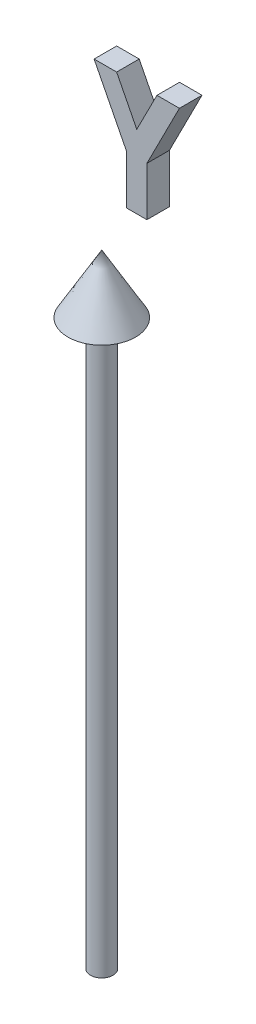
ISO-10303-21;
HEADER;
FILE_DESCRIPTION(('STEP AP214'),'2;1');
FILE_NAME('part.step','',(''),(''),'','','');
FILE_SCHEMA(('AUTOMOTIVE_DESIGN { 1 0 10303 214 1 1 1 1 }'));
ENDSEC;
DATA;
#1=APPLICATION_CONTEXT('core data for automotive mechanical design processes');
#2=APPLICATION_PROTOCOL_DEFINITION('international standard','automotive_design',2000,#1);
#3=PRODUCT_CONTEXT('',#1,'mechanical');
#4=PRODUCT('Part','Part','',(#3));
#5=PRODUCT_RELATED_PRODUCT_CATEGORY('part','',(#4));
#6=PRODUCT_DEFINITION_FORMATION('','',#4);
#7=PRODUCT_DEFINITION_CONTEXT('part definition',#1,'design');
#8=PRODUCT_DEFINITION('design','',#6,#7);
#9=PRODUCT_DEFINITION_SHAPE('','',#8);
#10=(LENGTH_UNIT() NAMED_UNIT(*) SI_UNIT(.MILLI.,.METRE.));
#11=(NAMED_UNIT(*) PLANE_ANGLE_UNIT() SI_UNIT($,.RADIAN.));
#12=(NAMED_UNIT(*) SI_UNIT($,.STERADIAN.) SOLID_ANGLE_UNIT());
#13=UNCERTAINTY_MEASURE_WITH_UNIT(LENGTH_MEASURE(1.E-05),#10,'distance_accuracy_value','');
#14=(GEOMETRIC_REPRESENTATION_CONTEXT(3) GLOBAL_UNCERTAINTY_ASSIGNED_CONTEXT((#13)) GLOBAL_UNIT_ASSIGNED_CONTEXT((#10,
#11,#12)) REPRESENTATION_CONTEXT('',''));
#15=CARTESIAN_POINT('',(0.,0.,0.));
#16=DIRECTION('',(0.,0.,1.));
#17=DIRECTION('',(1.,0.,0.));
#18=AXIS2_PLACEMENT_3D('',#15,#16,#17);
#19=CARTESIAN_POINT('',(3.2051282051282,64.8460182015524,1.));
#20=DIRECTION('',(-0.891255699585223,-0.453501133357851,0.));
#21=DIRECTION('',(0.453501133357851,-0.891255699585223,0.));
#22=AXIS2_PLACEMENT_3D('',#19,#20,#21);
#23=PLANE('',#22);
#24=DIRECTION('',(-0.453501133357851,0.891255699585223,0.));
#25=VECTOR('',#24,1.);
#26=CARTESIAN_POINT('',(3.2051282051282,64.8460182015524,-1.));
#27=LINE('',#26,#25);
#28=CARTESIAN_POINT('',(3.2051282051282,64.8460182015524,-1.));
#29=VERTEX_POINT('',#28);
#30=CARTESIAN_POINT('',(0.320512820512821,70.5150887143729,-1.));
#31=VERTEX_POINT('',#30);
#32=EDGE_CURVE('E156',#29,#31,#27,.T.);
#33=ORIENTED_EDGE('',*,*,#32,.F.);
#34=DIRECTION('',(0.,0.,-1.));
#35=VECTOR('',#34,1.);
#36=CARTESIAN_POINT('',(3.2051282051282,64.8460182015524,1.));
#37=LINE('',#36,#35);
#38=CARTESIAN_POINT('',(3.2051282051282,64.8460182015524,1.));
#39=VERTEX_POINT('',#38);
#40=EDGE_CURVE('E12',#39,#29,#37,.T.);
#41=ORIENTED_EDGE('',*,*,#40,.F.);
#42=DIRECTION('',(-0.453501133357851,0.891255699585223,0.));
#43=VECTOR('',#42,1.);
#44=CARTESIAN_POINT('',(3.2051282051282,64.8460182015524,1.));
#45=LINE('',#44,#43);
#46=CARTESIAN_POINT('',(0.320512820512821,70.5150887143729,1.));
#47=VERTEX_POINT('',#46);
#48=EDGE_CURVE('E179',#39,#47,#45,.T.);
#49=ORIENTED_EDGE('',*,*,#48,.T.);
#50=DIRECTION('',(0.,0.,-1.));
#51=VECTOR('',#50,1.);
#52=CARTESIAN_POINT('',(0.320512820512821,70.5150887143729,1.));
#53=LINE('',#52,#51);
#54=EDGE_CURVE('E56',#47,#31,#53,.T.);
#55=ORIENTED_EDGE('',*,*,#54,.T.);
#56=EDGE_LOOP('',(#33,#41,#49,#55));
#57=FACE_BOUND('',#56,.T.);
#58=ADVANCED_FACE('F53',(#57),#23,.T.);
#59=CARTESIAN_POINT('',(3.2051282051282,60.5150887143729,1.));
#60=DIRECTION('',(-1.,0.,0.));
#61=DIRECTION('',(0.,0.,1.));
#62=AXIS2_PLACEMENT_3D('',#59,#60,#61);
#63=PLANE('',#62);
#64=DIRECTION('',(0.,1.,0.));
#65=VECTOR('',#64,1.);
#66=CARTESIAN_POINT('',(3.2051282051282,60.5150887143729,-1.));
#67=LINE('',#66,#65);
#68=CARTESIAN_POINT('',(3.2051282051282,60.5150887143729,-1.));
#69=VERTEX_POINT('',#68);
#70=EDGE_CURVE('E177',#69,#29,#67,.T.);
#71=ORIENTED_EDGE('',*,*,#70,.F.);
#72=DIRECTION('',(0.,0.,-1.));
#73=VECTOR('',#72,1.);
#74=CARTESIAN_POINT('',(3.2051282051282,60.5150887143729,1.));
#75=LINE('',#74,#73);
#76=CARTESIAN_POINT('',(3.2051282051282,60.5150887143729,1.));
#77=VERTEX_POINT('',#76);
#78=EDGE_CURVE('E62',#77,#69,#75,.T.);
#79=ORIENTED_EDGE('',*,*,#78,.F.);
#80=DIRECTION('',(0.,1.,0.));
#81=VECTOR('',#80,1.);
#82=CARTESIAN_POINT('',(3.2051282051282,60.5150887143729,1.));
#83=LINE('',#82,#81);
#84=EDGE_CURVE('E146',#77,#39,#83,.T.);
#85=ORIENTED_EDGE('',*,*,#84,.T.);
#86=ORIENTED_EDGE('',*,*,#40,.T.);
#87=EDGE_LOOP('',(#71,#79,#85,#86));
#88=FACE_BOUND('',#87,.T.);
#89=ADVANCED_FACE('F193',(#88),#63,.T.);
#90=CARTESIAN_POINT('',(5.,60.5150887143729,1.));
#91=DIRECTION('',(0.,-1.,0.));
#92=DIRECTION('',(0.,0.,-1.));
#93=AXIS2_PLACEMENT_3D('',#90,#91,#92);
#94=PLANE('',#93);
#95=DIRECTION('',(-1.,0.,0.));
#96=VECTOR('',#95,1.);
#97=CARTESIAN_POINT('',(5.,60.5150887143729,-1.));
#98=LINE('',#97,#96);
#99=CARTESIAN_POINT('',(5.,60.5150887143729,-1.));
#100=VERTEX_POINT('',#99);
#101=EDGE_CURVE('E133',#100,#69,#98,.T.);
#102=ORIENTED_EDGE('',*,*,#101,.F.);
#103=DIRECTION('',(0.,0.,-1.));
#104=VECTOR('',#103,1.);
#105=CARTESIAN_POINT('',(5.,60.5150887143729,1.));
#106=LINE('',#105,#104);
#107=CARTESIAN_POINT('',(5.,60.5150887143729,1.));
#108=VERTEX_POINT('',#107);
#109=EDGE_CURVE('E128',#108,#100,#106,.T.);
#110=ORIENTED_EDGE('',*,*,#109,.F.);
#111=DIRECTION('',(-1.,0.,0.));
#112=VECTOR('',#111,1.);
#113=CARTESIAN_POINT('',(5.,60.5150887143729,1.));
#114=LINE('',#113,#112);
#115=EDGE_CURVE('E131',#108,#77,#114,.T.);
#116=ORIENTED_EDGE('',*,*,#115,.T.);
#117=ORIENTED_EDGE('',*,*,#78,.T.);
#118=EDGE_LOOP('',(#102,#110,#116,#117));
#119=FACE_BOUND('',#118,.T.);
#120=ADVANCED_FACE('F130',(#119),#94,.T.);
#121=CARTESIAN_POINT('',(5.,64.8460182015524,1.));
#122=DIRECTION('',(1.,0.,0.));
#123=DIRECTION('',(0.,0.,-1.));
#124=AXIS2_PLACEMENT_3D('',#121,#122,#123);
#125=PLANE('',#124);
#126=DIRECTION('',(0.,-1.,0.));
#127=VECTOR('',#126,1.);
#128=CARTESIAN_POINT('',(5.,64.8460182015524,-1.));
#129=LINE('',#128,#127);
#130=CARTESIAN_POINT('',(5.,64.8460182015524,-1.));
#131=VERTEX_POINT('',#130);
#132=EDGE_CURVE('E174',#131,#100,#129,.T.);
#133=ORIENTED_EDGE('',*,*,#132,.F.);
#134=DIRECTION('',(0.,0.,-1.));
#135=VECTOR('',#134,1.);
#136=CARTESIAN_POINT('',(5.,64.8460182015524,1.));
#137=LINE('',#136,#135);
#138=CARTESIAN_POINT('',(5.,64.8460182015524,1.));
#139=VERTEX_POINT('',#138);
#140=EDGE_CURVE('E138',#139,#131,#137,.T.);
#141=ORIENTED_EDGE('',*,*,#140,.F.);
#142=DIRECTION('',(0.,-1.,0.));
#143=VECTOR('',#142,1.);
#144=CARTESIAN_POINT('',(5.,64.8460182015524,1.));
#145=LINE('',#144,#143);
#146=EDGE_CURVE('E144',#139,#108,#145,.T.);
#147=ORIENTED_EDGE('',*,*,#146,.T.);
#148=ORIENTED_EDGE('',*,*,#109,.T.);
#149=EDGE_LOOP('',(#133,#141,#147,#148));
#150=FACE_BOUND('',#149,.T.);
#151=ADVANCED_FACE('F148',(#150),#125,.T.);
#152=CARTESIAN_POINT('',(7.88461538461538,70.5150887143729,1.));
#153=DIRECTION('',(0.891255699585223,-0.453501133357851,0.));
#154=DIRECTION('',(0.453501133357851,0.891255699585223,0.));
#155=AXIS2_PLACEMENT_3D('',#152,#153,#154);
#156=PLANE('',#155);
#157=DIRECTION('',(-0.453501133357851,-0.891255699585223,0.));
#158=VECTOR('',#157,1.);
#159=CARTESIAN_POINT('',(7.88461538461538,70.5150887143729,-1.));
#160=LINE('',#159,#158);
#161=CARTESIAN_POINT('',(7.88461538461538,70.5150887143729,-1.));
#162=VERTEX_POINT('',#161);
#163=EDGE_CURVE('E171',#162,#131,#160,.T.);
#164=ORIENTED_EDGE('',*,*,#163,.F.);
#165=DIRECTION('',(0.,0.,-1.));
#166=VECTOR('',#165,1.);
#167=CARTESIAN_POINT('',(7.88461538461538,70.5150887143729,1.));
#168=LINE('',#167,#166);
#169=CARTESIAN_POINT('',(7.88461538461538,70.5150887143729,1.));
#170=VERTEX_POINT('',#169);
#171=EDGE_CURVE('E183',#170,#162,#168,.T.);
#172=ORIENTED_EDGE('',*,*,#171,.F.);
#173=DIRECTION('',(-0.453501133357851,-0.891255699585223,0.));
#174=VECTOR('',#173,1.);
#175=CARTESIAN_POINT('',(7.88461538461538,70.5150887143729,1.));
#176=LINE('',#175,#174);
#177=EDGE_CURVE('E149',#170,#139,#176,.T.);
#178=ORIENTED_EDGE('',*,*,#177,.T.);
#179=ORIENTED_EDGE('',*,*,#140,.T.);
#180=EDGE_LOOP('',(#164,#172,#178,#179));
#181=FACE_BOUND('',#180,.T.);
#182=ADVANCED_FACE('F206',(#181),#156,.T.);
#183=CARTESIAN_POINT('',(5.89142628205128,70.5150887143729,1.));
#184=DIRECTION('',(0.,1.,0.));
#185=DIRECTION('',(0.,0.,1.));
#186=AXIS2_PLACEMENT_3D('',#183,#184,#185);
#187=PLANE('',#186);
#188=DIRECTION('',(1.,0.,0.));
#189=VECTOR('',#188,1.);
#190=CARTESIAN_POINT('',(5.89142628205128,70.5150887143729,-1.));
#191=LINE('',#190,#189);
#192=CARTESIAN_POINT('',(5.89142628205128,70.5150887143729,-1.));
#193=VERTEX_POINT('',#192);
#194=EDGE_CURVE('E168',#193,#162,#191,.T.);
#195=ORIENTED_EDGE('',*,*,#194,.F.);
#196=DIRECTION('',(0.,0.,-1.));
#197=VECTOR('',#196,1.);
#198=CARTESIAN_POINT('',(5.89142628205128,70.5150887143729,1.));
#199=LINE('',#198,#197);
#200=CARTESIAN_POINT('',(5.89142628205128,70.5150887143729,1.));
#201=VERTEX_POINT('',#200);
#202=EDGE_CURVE('E185',#201,#193,#199,.T.);
#203=ORIENTED_EDGE('',*,*,#202,.F.);
#204=DIRECTION('',(1.,0.,0.));
#205=VECTOR('',#204,1.);
#206=CARTESIAN_POINT('',(5.89142628205128,70.5150887143729,1.));
#207=LINE('',#206,#205);
#208=EDGE_CURVE('E151',#201,#170,#207,.T.);
#209=ORIENTED_EDGE('',*,*,#208,.T.);
#210=ORIENTED_EDGE('',*,*,#171,.T.);
#211=EDGE_LOOP('',(#195,#203,#209,#210));
#212=FACE_BOUND('',#211,.T.);
#213=ADVANCED_FACE('F209',(#212),#187,.T.);
#214=CARTESIAN_POINT('',(4.1025641025641,67.0054733297575,1.));
#215=DIRECTION('',(-0.890942456455921,0.454116217816859,0.));
#216=DIRECTION('',(-0.454116217816859,-0.890942456455921,0.));
#217=AXIS2_PLACEMENT_3D('',#214,#215,#216);
#218=PLANE('',#217);
#219=DIRECTION('',(0.454116217816859,0.890942456455921,0.));
#220=VECTOR('',#219,1.);
#221=CARTESIAN_POINT('',(4.1025641025641,67.0054733297575,-1.));
#222=LINE('',#221,#220);
#223=CARTESIAN_POINT('',(4.1025641025641,67.0054733297575,-1.));
#224=VERTEX_POINT('',#223);
#225=EDGE_CURVE('E165',#224,#193,#222,.T.);
#226=ORIENTED_EDGE('',*,*,#225,.F.);
#227=DIRECTION('',(0.,0.,-1.));
#228=VECTOR('',#227,1.);
#229=CARTESIAN_POINT('',(4.1025641025641,67.0054733297575,1.));
#230=LINE('',#229,#228);
#231=CARTESIAN_POINT('',(4.1025641025641,67.0054733297575,1.));
#232=VERTEX_POINT('',#231);
#233=EDGE_CURVE('E187',#232,#224,#230,.T.);
#234=ORIENTED_EDGE('',*,*,#233,.F.);
#235=DIRECTION('',(0.454116217816859,0.890942456455921,0.));
#236=VECTOR('',#235,1.);
#237=CARTESIAN_POINT('',(4.1025641025641,67.0054733297575,1.));
#238=LINE('',#237,#236);
#239=EDGE_CURVE('E316',#232,#201,#238,.T.);
#240=ORIENTED_EDGE('',*,*,#239,.T.);
#241=ORIENTED_EDGE('',*,*,#202,.T.);
#242=EDGE_LOOP('',(#226,#234,#240,#241));
#243=FACE_BOUND('',#242,.T.);
#244=ADVANCED_FACE('F213',(#243),#218,.T.);
#245=CARTESIAN_POINT('',(2.31770833333333,70.5150887143729,1.));
#246=DIRECTION('',(0.89135377309471,0.453308340084124,0.));
#247=DIRECTION('',(-0.453308340084124,0.89135377309471,0.));
#248=AXIS2_PLACEMENT_3D('',#245,#246,#247);
#249=PLANE('',#248);
#250=DIRECTION('',(0.453308340084124,-0.89135377309471,0.));
#251=VECTOR('',#250,1.);
#252=CARTESIAN_POINT('',(2.31770833333333,70.5150887143729,-1.));
#253=LINE('',#252,#251);
#254=CARTESIAN_POINT('',(2.31770833333333,70.5150887143729,-1.));
#255=VERTEX_POINT('',#254);
#256=EDGE_CURVE('E162',#255,#224,#253,.T.);
#257=ORIENTED_EDGE('',*,*,#256,.F.);
#258=DIRECTION('',(0.,0.,-1.));
#259=VECTOR('',#258,1.);
#260=CARTESIAN_POINT('',(2.31770833333333,70.5150887143729,1.));
#261=LINE('',#260,#259);
#262=CARTESIAN_POINT('',(2.31770833333333,70.5150887143729,1.));
#263=VERTEX_POINT('',#262);
#264=EDGE_CURVE('E188',#263,#255,#261,.T.);
#265=ORIENTED_EDGE('',*,*,#264,.F.);
#266=DIRECTION('',(0.453308340084124,-0.89135377309471,0.));
#267=VECTOR('',#266,1.);
#268=CARTESIAN_POINT('',(2.31770833333333,70.5150887143729,1.));
#269=LINE('',#268,#267);
#270=EDGE_CURVE('E320',#263,#232,#269,.T.);
#271=ORIENTED_EDGE('',*,*,#270,.T.);
#272=ORIENTED_EDGE('',*,*,#233,.T.);
#273=EDGE_LOOP('',(#257,#265,#271,#272));
#274=FACE_BOUND('',#273,.T.);
#275=ADVANCED_FACE('F217',(#274),#249,.T.);
#276=CARTESIAN_POINT('',(0.320512820512821,70.5150887143729,1.));
#277=DIRECTION('',(0.,1.,0.));
#278=DIRECTION('',(0.,0.,1.));
#279=AXIS2_PLACEMENT_3D('',#276,#277,#278);
#280=PLANE('',#279);
#281=DIRECTION('',(1.,0.,0.));
#282=VECTOR('',#281,1.);
#283=CARTESIAN_POINT('',(0.320512820512821,70.5150887143729,-1.));
#284=LINE('',#283,#282);
#285=EDGE_CURVE('E159',#31,#255,#284,.T.);
#286=ORIENTED_EDGE('',*,*,#285,.F.);
#287=ORIENTED_EDGE('',*,*,#54,.F.);
#288=DIRECTION('',(1.,0.,0.));
#289=VECTOR('',#288,1.);
#290=CARTESIAN_POINT('',(0.320512820512821,70.5150887143729,1.));
#291=LINE('',#290,#289);
#292=EDGE_CURVE('E324',#47,#263,#291,.T.);
#293=ORIENTED_EDGE('',*,*,#292,.T.);
#294=ORIENTED_EDGE('',*,*,#264,.T.);
#295=EDGE_LOOP('',(#286,#287,#293,#294));
#296=FACE_BOUND('',#295,.T.);
#297=ADVANCED_FACE('F190',(#296),#280,.T.);
#298=CARTESIAN_POINT('',(0.,0.,1.));
#299=DIRECTION('',(0.,0.,-1.));
#300=DIRECTION('',(-1.,0.,0.));
#301=AXIS2_PLACEMENT_3D('',#298,#299,#300);
#302=PLANE('',#301);
#303=ORIENTED_EDGE('',*,*,#48,.F.);
#304=ORIENTED_EDGE('',*,*,#84,.F.);
#305=ORIENTED_EDGE('',*,*,#115,.F.);
#306=ORIENTED_EDGE('',*,*,#146,.F.);
#307=ORIENTED_EDGE('',*,*,#177,.F.);
#308=ORIENTED_EDGE('',*,*,#208,.F.);
#309=ORIENTED_EDGE('',*,*,#239,.F.);
#310=ORIENTED_EDGE('',*,*,#270,.F.);
#311=ORIENTED_EDGE('',*,*,#292,.F.);
#312=EDGE_LOOP('',(#303,#304,#305,#306,#307,#308,#309,#310,#311));
#313=FACE_BOUND('',#312,.T.);
#314=ADVANCED_FACE('F142',(#313),#302,.F.);
#315=CARTESIAN_POINT('',(0.,0.,-1.));
#316=DIRECTION('',(0.,0.,-1.));
#317=DIRECTION('',(-1.,0.,0.));
#318=AXIS2_PLACEMENT_3D('',#315,#316,#317);
#319=PLANE('',#318);
#320=ORIENTED_EDGE('',*,*,#32,.T.);
#321=ORIENTED_EDGE('',*,*,#285,.T.);
#322=ORIENTED_EDGE('',*,*,#256,.T.);
#323=ORIENTED_EDGE('',*,*,#225,.T.);
#324=ORIENTED_EDGE('',*,*,#194,.T.);
#325=ORIENTED_EDGE('',*,*,#163,.T.);
#326=ORIENTED_EDGE('',*,*,#132,.T.);
#327=ORIENTED_EDGE('',*,*,#101,.T.);
#328=ORIENTED_EDGE('',*,*,#70,.T.);
#329=EDGE_LOOP('',(#320,#321,#322,#323,#324,#325,#326,#327,#328));
#330=FACE_BOUND('',#329,.T.);
#331=ADVANCED_FACE('F192',(#330),#319,.T.);
#332=CLOSED_SHELL('',(#58,#89,#120,#151,#182,#213,#244,#275,#297,#314,#331));
#333=MANIFOLD_SOLID_BREP('B2',#332);
#334=CARTESIAN_POINT('',(0.,50.,0.));
#335=DIRECTION('',(0.,-1.,0.));
#336=DIRECTION('',(0.,0.,-1.));
#337=AXIS2_PLACEMENT_3D('',#334,#335,#336);
#338=CYLINDRICAL_SURFACE('',#337,1.);
#339=CARTESIAN_POINT('',(0.,50.,0.));
#340=DIRECTION('',(0.,1.,0.));
#341=DIRECTION('',(0.,0.,1.));
#342=AXIS2_PLACEMENT_3D('',#339,#340,#341);
#343=CIRCLE('',#342,1.);
#344=CARTESIAN_POINT('',(0.,50.,1.));
#345=VERTEX_POINT('',#344);
#346=EDGE_CURVE('E51',#345,#345,#343,.T.);
#347=ORIENTED_EDGE('',*,*,#346,.F.);
#348=EDGE_LOOP('',(#347));
#349=FACE_BOUND('',#348,.T.);
#350=CARTESIAN_POINT('',(0.,0.,0.));
#351=DIRECTION('',(0.,1.,0.));
#352=DIRECTION('',(0.,0.,1.));
#353=AXIS2_PLACEMENT_3D('',#350,#351,#352);
#354=CIRCLE('',#353,1.);
#355=CARTESIAN_POINT('',(0.,0.,1.));
#356=VERTEX_POINT('',#355);
#357=EDGE_CURVE('E332',#356,#356,#354,.T.);
#358=ORIENTED_EDGE('',*,*,#357,.T.);
#359=EDGE_LOOP('',(#358));
#360=FACE_BOUND('',#359,.T.);
#361=ADVANCED_FACE('F329',(#349,#360),#338,.T.);
#362=CARTESIAN_POINT('',(0.,0.,0.));
#363=DIRECTION('',(0.,1.,0.));
#364=DIRECTION('',(0.,0.,1.));
#365=AXIS2_PLACEMENT_3D('',#362,#363,#364);
#366=PLANE('',#365);
#367=ORIENTED_EDGE('',*,*,#357,.F.);
#368=EDGE_LOOP('',(#367));
#369=FACE_BOUND('',#368,.T.);
#370=ADVANCED_FACE('F347',(#369),#366,.F.);
#371=CARTESIAN_POINT('',(0.,50.,0.));
#372=DIRECTION('',(0.,-1.,0.));
#373=DIRECTION('',(0.,0.,-1.));
#374=AXIS2_PLACEMENT_3D('',#371,#372,#373);
#375=PLANE('',#374);
#376=ORIENTED_EDGE('',*,*,#346,.T.);
#377=EDGE_LOOP('',(#376));
#378=FACE_BOUND('',#377,.T.);
#379=CARTESIAN_POINT('',(0.,50.,0.));
#380=DIRECTION('',(0.,1.,0.));
#381=DIRECTION('',(0.,0.,1.));
#382=AXIS2_PLACEMENT_3D('',#379,#380,#381);
#383=CIRCLE('',#382,3.);
#384=CARTESIAN_POINT('',(0.,50.,3.));
#385=VERTEX_POINT('',#384);
#386=EDGE_CURVE('E362',#385,#385,#383,.T.);
#387=ORIENTED_EDGE('',*,*,#386,.F.);
#388=EDGE_LOOP('',(#387));
#389=FACE_BOUND('',#388,.T.);
#390=ADVANCED_FACE('F341',(#378,#389),#375,.T.);
#391=CARTESIAN_POINT('',(0.,55.1961524227066,0.));
#392=DIRECTION('',(0.,-1.,0.));
#393=DIRECTION('',(0.,0.,-1.));
#394=AXIS2_PLACEMENT_3D('',#391,#392,#393);
#395=CONICAL_SURFACE('',#394,0.,0.523598775598304);
#396=ORIENTED_EDGE('',*,*,#386,.T.);
#397=EDGE_LOOP('',(#396));
#398=FACE_BOUND('',#397,.T.);
#399=CARTESIAN_POINT('',(0.,55.1961524227066,0.));
#400=VERTEX_POINT('',#399);
#401=VERTEX_LOOP('',#400);
#402=FACE_BOUND('',#401,.T.);
#403=ADVANCED_FACE('F339',(#398,#402),#395,.T.);
#404=CLOSED_SHELL('',(#361,#370,#390,#403));
#405=MANIFOLD_SOLID_BREP('B6',#404);
#406=ADVANCED_BREP_SHAPE_REPRESENTATION('',(#18,#333,#405),#14);
#407=SHAPE_DEFINITION_REPRESENTATION(#9,#406);
ENDSEC;
END-ISO-10303-21;
